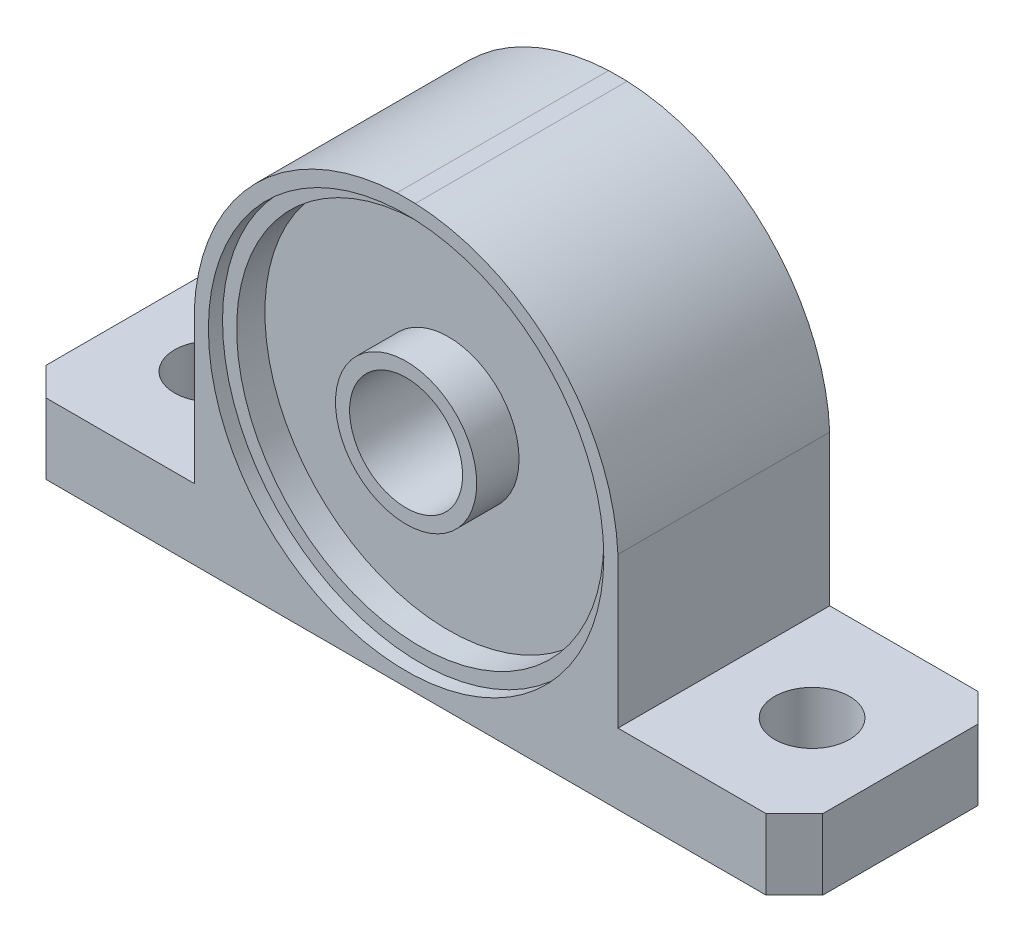
ISO-10303-21;
HEADER;
FILE_DESCRIPTION(('STEP AP214'),'2;1');
FILE_NAME('part.step','',(''),(''),'','','');
FILE_SCHEMA(('AUTOMOTIVE_DESIGN { 1 0 10303 214 1 1 1 1 }'));
ENDSEC;
DATA;
#1=APPLICATION_CONTEXT('core data for automotive mechanical design processes');
#2=APPLICATION_PROTOCOL_DEFINITION('international standard','automotive_design',2000,#1);
#3=PRODUCT_CONTEXT('',#1,'mechanical');
#4=PRODUCT('Part','Part','',(#3));
#5=PRODUCT_RELATED_PRODUCT_CATEGORY('part','',(#4));
#6=PRODUCT_DEFINITION_FORMATION('','',#4);
#7=PRODUCT_DEFINITION_CONTEXT('part definition',#1,'design');
#8=PRODUCT_DEFINITION('design','',#6,#7);
#9=PRODUCT_DEFINITION_SHAPE('','',#8);
#10=(LENGTH_UNIT() NAMED_UNIT(*) SI_UNIT(.MILLI.,.METRE.));
#11=(NAMED_UNIT(*) PLANE_ANGLE_UNIT() SI_UNIT($,.RADIAN.));
#12=(NAMED_UNIT(*) SI_UNIT($,.STERADIAN.) SOLID_ANGLE_UNIT());
#13=UNCERTAINTY_MEASURE_WITH_UNIT(LENGTH_MEASURE(1.E-05),#10,'distance_accuracy_value','');
#14=(GEOMETRIC_REPRESENTATION_CONTEXT(3) GLOBAL_UNCERTAINTY_ASSIGNED_CONTEXT((#13)) GLOBAL_UNIT_ASSIGNED_CONTEXT((#10,
#11,#12)) REPRESENTATION_CONTEXT('',''));
#15=CARTESIAN_POINT('',(0.,0.,0.));
#16=DIRECTION('',(0.,0.,1.));
#17=DIRECTION('',(1.,0.,0.));
#18=AXIS2_PLACEMENT_3D('',#15,#16,#17);
#19=CARTESIAN_POINT('',(0.,0.,0.));
#20=DIRECTION('',(0.,-1.,0.));
#21=DIRECTION('',(0.,0.,-1.));
#22=AXIS2_PLACEMENT_3D('',#19,#20,#21);
#23=PLANE('',#22);
#24=CARTESIAN_POINT('',(21.25,0.,0.));
#25=DIRECTION('',(0.,1.,0.));
#26=DIRECTION('',(0.,0.,1.));
#27=AXIS2_PLACEMENT_3D('',#24,#25,#26);
#28=CIRCLE('',#27,2.65);
#29=CARTESIAN_POINT('',(21.25,0.,2.65000000000001));
#30=VERTEX_POINT('',#29);
#31=EDGE_CURVE('E317',#30,#30,#28,.F.);
#32=ORIENTED_EDGE('',*,*,#31,.F.);
#33=EDGE_LOOP('',(#32));
#34=FACE_BOUND('',#33,.T.);
#35=DIRECTION('',(-1.,0.,0.));
#36=VECTOR('',#35,1.);
#37=CARTESIAN_POINT('',(-25.5,0.,-7.5));
#38=LINE('',#37,#36);
#39=CARTESIAN_POINT('',(25.5,0.,-7.5));
#40=VERTEX_POINT('',#39);
#41=CARTESIAN_POINT('',(-25.5,0.,-7.5));
#42=VERTEX_POINT('',#41);
#43=EDGE_CURVE('E164',#40,#42,#38,.T.);
#44=ORIENTED_EDGE('',*,*,#43,.F.);
#45=DIRECTION('',(-0.707106781186548,0.,-0.707106781186547));
#46=VECTOR('',#45,1.);
#47=CARTESIAN_POINT('',(25.5,0.,-7.5));
#48=LINE('',#47,#46);
#49=CARTESIAN_POINT('',(27.5,0.,-5.5));
#50=VERTEX_POINT('',#49);
#51=EDGE_CURVE('E204',#50,#40,#48,.T.);
#52=ORIENTED_EDGE('',*,*,#51,.F.);
#53=DIRECTION('',(0.,0.,-1.));
#54=VECTOR('',#53,1.);
#55=CARTESIAN_POINT('',(27.5,0.,-5.5));
#56=LINE('',#55,#54);
#57=CARTESIAN_POINT('',(27.5,0.,5.5));
#58=VERTEX_POINT('',#57);
#59=EDGE_CURVE('E202',#58,#50,#56,.T.);
#60=ORIENTED_EDGE('',*,*,#59,.F.);
#61=DIRECTION('',(0.707106781186548,0.,-0.707106781186547));
#62=VECTOR('',#61,1.);
#63=CARTESIAN_POINT('',(25.5,0.,7.5));
#64=LINE('',#63,#62);
#65=CARTESIAN_POINT('',(25.5,0.,7.5));
#66=VERTEX_POINT('',#65);
#67=EDGE_CURVE('E200',#66,#58,#64,.T.);
#68=ORIENTED_EDGE('',*,*,#67,.F.);
#69=DIRECTION('',(1.,0.,0.));
#70=VECTOR('',#69,1.);
#71=CARTESIAN_POINT('',(-25.5,0.,7.5));
#72=LINE('',#71,#70);
#73=CARTESIAN_POINT('',(-25.5,0.,7.5));
#74=VERTEX_POINT('',#73);
#75=EDGE_CURVE('E198',#74,#66,#72,.T.);
#76=ORIENTED_EDGE('',*,*,#75,.F.);
#77=DIRECTION('',(0.707106781186548,0.,0.707106781186547));
#78=VECTOR('',#77,1.);
#79=CARTESIAN_POINT('',(-27.5,0.,5.5));
#80=LINE('',#79,#78);
#81=CARTESIAN_POINT('',(-27.5,0.,5.5));
#82=VERTEX_POINT('',#81);
#83=EDGE_CURVE('E196',#82,#74,#80,.T.);
#84=ORIENTED_EDGE('',*,*,#83,.F.);
#85=DIRECTION('',(0.,0.,1.));
#86=VECTOR('',#85,1.);
#87=CARTESIAN_POINT('',(-27.5,0.,-5.5));
#88=LINE('',#87,#86);
#89=CARTESIAN_POINT('',(-27.5,0.,-5.5));
#90=VERTEX_POINT('',#89);
#91=EDGE_CURVE('E194',#90,#82,#88,.T.);
#92=ORIENTED_EDGE('',*,*,#91,.F.);
#93=DIRECTION('',(-0.707106781186548,0.,0.707106781186547));
#94=VECTOR('',#93,1.);
#95=CARTESIAN_POINT('',(-27.5,0.,-5.5));
#96=LINE('',#95,#94);
#97=EDGE_CURVE('E192',#42,#90,#96,.T.);
#98=ORIENTED_EDGE('',*,*,#97,.F.);
#99=EDGE_LOOP('',(#44,#52,#60,#68,#76,#84,#92,#98));
#100=FACE_BOUND('',#99,.T.);
#101=CARTESIAN_POINT('',(-21.25,0.,0.));
#102=DIRECTION('',(0.,1.,0.));
#103=DIRECTION('',(0.,0.,1.));
#104=AXIS2_PLACEMENT_3D('',#101,#102,#103);
#105=CIRCLE('',#104,2.65);
#106=CARTESIAN_POINT('',(-21.25,0.,2.65));
#107=VERTEX_POINT('',#106);
#108=EDGE_CURVE('E313',#107,#107,#105,.T.);
#109=ORIENTED_EDGE('',*,*,#108,.T.);
#110=EDGE_LOOP('',(#109));
#111=FACE_BOUND('',#110,.T.);
#112=ADVANCED_FACE('F40',(#34,#100,#111),#23,.T.);
#113=CARTESIAN_POINT('',(0.,15.,-7.5));
#114=DIRECTION('',(0.,0.,1.));
#115=DIRECTION('',(1.,0.,0.));
#116=AXIS2_PLACEMENT_3D('',#113,#114,#115);
#117=CYLINDRICAL_SURFACE('',#116,4.);
#118=CARTESIAN_POINT('',(0.,15.,7.5));
#119=DIRECTION('',(0.,0.,-1.));
#120=DIRECTION('',(-1.,0.,0.));
#121=AXIS2_PLACEMENT_3D('',#118,#119,#120);
#122=CIRCLE('',#121,4.);
#123=CARTESIAN_POINT('',(4.,15.,7.5));
#124=VERTEX_POINT('',#123);
#125=EDGE_CURVE('E44',#124,#124,#122,.T.);
#126=CARTESIAN_POINT('',(0.,15.,-5.5));
#127=DIRECTION('',(0.,0.,-1.));
#128=DIRECTION('',(-1.,0.,0.));
#129=AXIS2_PLACEMENT_3D('',#126,#127,#128);
#130=CIRCLE('',#129,4.);
#131=CARTESIAN_POINT('',(4.,15.,-5.5));
#132=VERTEX_POINT('',#131);
#133=EDGE_CURVE('E303',#132,#132,#130,.F.);
#134=CARTESIAN_POINT('',(4.,15.,7.5));
#135=CARTESIAN_POINT('',(4.,15.,7.36458333333333));
#136=CARTESIAN_POINT('',(4.,15.,7.22916666666667));
#137=CARTESIAN_POINT('',(4.,15.,6.95833333333333));
#138=CARTESIAN_POINT('',(4.,15.,6.82291666666667));
#139=CARTESIAN_POINT('',(4.,15.,6.55208333333333));
#140=CARTESIAN_POINT('',(4.,15.,6.41666666666667));
#141=CARTESIAN_POINT('',(4.,15.,6.14583333333333));
#142=CARTESIAN_POINT('',(4.,15.,6.01041666666667));
#143=CARTESIAN_POINT('',(4.,15.,5.73958333333333));
#144=CARTESIAN_POINT('',(4.,15.,5.60416666666667));
#145=CARTESIAN_POINT('',(4.,15.,5.33333333333333));
#146=CARTESIAN_POINT('',(4.,15.,5.19791666666667));
#147=CARTESIAN_POINT('',(4.,15.,4.92708333333333));
#148=CARTESIAN_POINT('',(4.,15.,4.79166666666667));
#149=CARTESIAN_POINT('',(4.,15.,4.52083333333333));
#150=CARTESIAN_POINT('',(4.,15.,4.38541666666667));
#151=CARTESIAN_POINT('',(4.,15.,4.11458333333333));
#152=CARTESIAN_POINT('',(4.,15.,3.97916666666667));
#153=CARTESIAN_POINT('',(4.,15.,3.70833333333333));
#154=CARTESIAN_POINT('',(4.,15.,3.57291666666667));
#155=CARTESIAN_POINT('',(4.,15.,3.30208333333333));
#156=CARTESIAN_POINT('',(4.,15.,3.16666666666667));
#157=CARTESIAN_POINT('',(4.,15.,2.89583333333333));
#158=CARTESIAN_POINT('',(4.,15.,2.76041666666667));
#159=CARTESIAN_POINT('',(4.,15.,2.48958333333333));
#160=CARTESIAN_POINT('',(4.,15.,2.35416666666667));
#161=CARTESIAN_POINT('',(4.,15.,2.08333333333333));
#162=CARTESIAN_POINT('',(4.,15.,1.94791666666666));
#163=CARTESIAN_POINT('',(4.,15.,1.67708333333333));
#164=CARTESIAN_POINT('',(4.,15.,1.54166666666667));
#165=CARTESIAN_POINT('',(4.,15.,1.27083333333333));
#166=CARTESIAN_POINT('',(4.,15.,1.13541666666667));
#167=CARTESIAN_POINT('',(4.,15.,0.864583333333332));
#168=CARTESIAN_POINT('',(4.,15.,0.729166666666666));
#169=CARTESIAN_POINT('',(4.,15.,0.458333333333333));
#170=CARTESIAN_POINT('',(4.,15.,0.322916666666666));
#171=CARTESIAN_POINT('',(4.,15.,0.0520833333333334));
#172=CARTESIAN_POINT('',(4.,15.,-0.0833333333333334));
#173=CARTESIAN_POINT('',(4.,15.,-0.354166666666667));
#174=CARTESIAN_POINT('',(4.,15.,-0.489583333333333));
#175=CARTESIAN_POINT('',(4.,15.,-0.760416666666667));
#176=CARTESIAN_POINT('',(4.,15.,-0.895833333333333));
#177=CARTESIAN_POINT('',(4.,15.,-1.16666666666667));
#178=CARTESIAN_POINT('',(4.,15.,-1.30208333333333));
#179=CARTESIAN_POINT('',(4.,15.,-1.57291666666667));
#180=CARTESIAN_POINT('',(4.,15.,-1.70833333333333));
#181=CARTESIAN_POINT('',(4.,15.,-1.97916666666667));
#182=CARTESIAN_POINT('',(4.,15.,-2.11458333333333));
#183=CARTESIAN_POINT('',(4.,15.,-2.38541666666667));
#184=CARTESIAN_POINT('',(4.,15.,-2.52083333333333));
#185=CARTESIAN_POINT('',(4.,15.,-2.79166666666667));
#186=CARTESIAN_POINT('',(4.,15.,-2.92708333333333));
#187=CARTESIAN_POINT('',(4.,15.,-3.19791666666667));
#188=CARTESIAN_POINT('',(4.,15.,-3.33333333333333));
#189=CARTESIAN_POINT('',(4.,15.,-3.60416666666667));
#190=CARTESIAN_POINT('',(4.,15.,-3.73958333333333));
#191=CARTESIAN_POINT('',(4.,15.,-4.01041666666667));
#192=CARTESIAN_POINT('',(4.,15.,-4.14583333333333));
#193=CARTESIAN_POINT('',(4.,15.,-4.41666666666667));
#194=CARTESIAN_POINT('',(4.,15.,-4.55208333333333));
#195=CARTESIAN_POINT('',(4.,15.,-4.82291666666667));
#196=CARTESIAN_POINT('',(4.,15.,-4.95833333333333));
#197=CARTESIAN_POINT('',(4.,15.,-5.22916666666667));
#198=CARTESIAN_POINT('',(4.,15.,-5.36458333333333));
#199=CARTESIAN_POINT('',(4.,15.,-5.5));
#200=B_SPLINE_CURVE_WITH_KNOTS('',3,(#134,#135,#136,#137,#138,#139,#140,#141,#142,#143,#144,
#145,#146,#147,#148,#149,#150,#151,#152,#153,#154,#155,#156,#157,#158,#159,#160,#161,#162,#163,
#164,#165,#166,#167,#168,#169,#170,#171,#172,#173,#174,#175,#176,#177,#178,#179,#180,#181,#182,
#183,#184,#185,#186,#187,#188,#189,#190,#191,#192,#193,#194,#195,#196,#197,#198,#199),
.UNSPECIFIED.,.F.,.F.,(4,2,2,2,2,2,2,2,2,2,2,2,2,2,2,2,2,2,2,2,2,2,2,2,2,2,2,2,2,2,2,2,4),(0.,
0.40625,0.812500000000001,1.21875,1.625,2.03125,2.4375,2.84375,3.25,3.65625,4.0625,4.46875,
4.875,5.28125,5.6875,6.09375,6.5,6.90625,7.3125,7.71875,8.125,8.53125,8.9375,9.34375,9.75,
10.15625,10.5625,10.96875,11.375,11.78125,12.1875,12.59375,13.),.UNSPECIFIED.);
#201=EDGE_CURVE('BSEAM345',#124,#132,#200,.T.);
#202=ORIENTED_EDGE('',*,*,#125,.F.);
#203=ORIENTED_EDGE('',*,*,#133,.F.);
#204=ORIENTED_EDGE('',*,*,#201,.T.);
#205=ORIENTED_EDGE('',*,*,#201,.F.);
#206=EDGE_LOOP('',(#202,#204,#203,#205));
#207=FACE_BOUND('',#206,.T.);
#208=ADVANCED_FACE('F345',(#207),#117,.F.);
#209=CARTESIAN_POINT('',(0.,15.,-4.5));
#210=DIRECTION('',(0.,0.,-1.));
#211=DIRECTION('',(-1.,0.,0.));
#212=AXIS2_PLACEMENT_3D('',#209,#210,#211);
#213=CYLINDRICAL_SURFACE('',#212,5.);
#214=CARTESIAN_POINT('',(0.,15.,-4.5));
#215=DIRECTION('',(0.,0.,-1.));
#216=DIRECTION('',(-1.,0.,0.));
#217=AXIS2_PLACEMENT_3D('',#214,#215,#216);
#218=CIRCLE('',#217,5.);
#219=CARTESIAN_POINT('',(-5.,15.,-4.5));
#220=VERTEX_POINT('',#219);
#221=EDGE_CURVE('E288',#220,#220,#218,.F.);
#222=ORIENTED_EDGE('',*,*,#221,.F.);
#223=EDGE_LOOP('',(#222));
#224=FACE_BOUND('',#223,.T.);
#225=CARTESIAN_POINT('',(0.,15.,-5.5));
#226=DIRECTION('',(0.,0.,-1.));
#227=DIRECTION('',(-1.,0.,0.));
#228=AXIS2_PLACEMENT_3D('',#225,#226,#227);
#229=CIRCLE('',#228,5.);
#230=CARTESIAN_POINT('',(-5.,15.,-5.5));
#231=VERTEX_POINT('',#230);
#232=EDGE_CURVE('E310',#231,#231,#229,.F.);
#233=ORIENTED_EDGE('',*,*,#232,.T.);
#234=EDGE_LOOP('',(#233));
#235=FACE_BOUND('',#234,.T.);
#236=ADVANCED_FACE('F350',(#224,#235),#213,.T.);
#237=CARTESIAN_POINT('',(-25.5,5.,-7.5));
#238=DIRECTION('',(0.,0.,1.));
#239=DIRECTION('',(1.,0.,0.));
#240=AXIS2_PLACEMENT_3D('',#237,#238,#239);
#241=PLANE('',#240);
#242=DIRECTION('',(0.,-1.,0.));
#243=VECTOR('',#242,1.);
#244=CARTESIAN_POINT('',(-15.,30.,-7.5));
#245=LINE('',#244,#243);
#246=CARTESIAN_POINT('',(-15.,15.6527900412671,-7.5));
#247=VERTEX_POINT('',#246);
#248=CARTESIAN_POINT('',(-15.,5.,-7.5));
#249=VERTEX_POINT('',#248);
#250=EDGE_CURVE('E154',#247,#249,#245,.T.);
#251=ORIENTED_EDGE('',*,*,#250,.F.);
#252=CARTESIAN_POINT('',(0.,15.,-7.5));
#253=DIRECTION('',(0.,0.,1.));
#254=DIRECTION('',(1.,0.,0.));
#255=AXIS2_PLACEMENT_3D('',#252,#253,#254);
#256=CIRCLE('',#255,15.0141977753717);
#257=CARTESIAN_POINT('',(-0.65279004126701,30.,-7.5));
#258=VERTEX_POINT('',#257);
#259=EDGE_CURVE('E140',#247,#258,#256,.F.);
#260=ORIENTED_EDGE('',*,*,#259,.T.);
#261=DIRECTION('',(-1.,0.,0.));
#262=VECTOR('',#261,1.);
#263=CARTESIAN_POINT('',(-15.,30.,-7.5));
#264=LINE('',#263,#262);
#265=CARTESIAN_POINT('',(0.652790041267009,30.,-7.5));
#266=VERTEX_POINT('',#265);
#267=EDGE_CURVE('E250',#266,#258,#264,.T.);
#268=ORIENTED_EDGE('',*,*,#267,.F.);
#269=CARTESIAN_POINT('',(0.,15.,-7.5));
#270=DIRECTION('',(0.,0.,1.));
#271=DIRECTION('',(1.,0.,0.));
#272=AXIS2_PLACEMENT_3D('',#269,#270,#271);
#273=CIRCLE('',#272,15.0141977753717);
#274=CARTESIAN_POINT('',(15.,15.6527900412671,-7.5));
#275=VERTEX_POINT('',#274);
#276=EDGE_CURVE('E64',#266,#275,#273,.F.);
#277=ORIENTED_EDGE('',*,*,#276,.T.);
#278=DIRECTION('',(0.,-1.,0.));
#279=VECTOR('',#278,1.);
#280=CARTESIAN_POINT('',(15.,30.,-7.5));
#281=LINE('',#280,#279);
#282=CARTESIAN_POINT('',(15.,5.,-7.5));
#283=VERTEX_POINT('',#282);
#284=EDGE_CURVE('E162',#275,#283,#281,.T.);
#285=ORIENTED_EDGE('',*,*,#284,.T.);
#286=DIRECTION('',(-1.,0.,0.));
#287=VECTOR('',#286,1.);
#288=CARTESIAN_POINT('',(-25.5,5.,-7.5));
#289=LINE('',#288,#287);
#290=CARTESIAN_POINT('',(25.5,5.,-7.5));
#291=VERTEX_POINT('',#290);
#292=EDGE_CURVE('E170',#291,#283,#289,.T.);
#293=ORIENTED_EDGE('',*,*,#292,.F.);
#294=DIRECTION('',(0.,-1.,0.));
#295=VECTOR('',#294,1.);
#296=CARTESIAN_POINT('',(25.5,5.,-7.5));
#297=LINE('',#296,#295);
#298=EDGE_CURVE('E189',#291,#40,#297,.T.);
#299=ORIENTED_EDGE('',*,*,#298,.T.);
#300=ORIENTED_EDGE('',*,*,#43,.T.);
#301=DIRECTION('',(0.,-1.,0.));
#302=VECTOR('',#301,1.);
#303=CARTESIAN_POINT('',(-25.5,5.,-7.5));
#304=LINE('',#303,#302);
#305=CARTESIAN_POINT('',(-25.5,5.,-7.5));
#306=VERTEX_POINT('',#305);
#307=EDGE_CURVE('E11',#306,#42,#304,.T.);
#308=ORIENTED_EDGE('',*,*,#307,.F.);
#309=EDGE_CURVE('E161',#249,#306,#289,.T.);
#310=ORIENTED_EDGE('',*,*,#309,.F.);
#311=EDGE_LOOP('',(#251,#260,#268,#277,#285,#293,#299,#300,#308,#310));
#312=FACE_BOUND('',#311,.T.);
#313=CARTESIAN_POINT('',(0.,15.,-7.5));
#314=DIRECTION('',(0.,0.,-1.));
#315=DIRECTION('',(-1.,0.,0.));
#316=AXIS2_PLACEMENT_3D('',#313,#314,#315);
#317=CIRCLE('',#316,14.);
#318=CARTESIAN_POINT('',(-14.,15.,-7.5));
#319=VERTEX_POINT('',#318);
#320=EDGE_CURVE('E299',#319,#319,#317,.F.);
#321=ORIENTED_EDGE('',*,*,#320,.T.);
#322=EDGE_LOOP('',(#321));
#323=FACE_BOUND('',#322,.T.);
#324=ADVANCED_FACE('F42',(#312,#323),#241,.F.);
#325=CARTESIAN_POINT('',(0.,15.,-4.5));
#326=DIRECTION('',(0.,0.,-1.));
#327=DIRECTION('',(-1.,0.,0.));
#328=AXIS2_PLACEMENT_3D('',#325,#326,#327);
#329=CYLINDRICAL_SURFACE('',#328,13.);
#330=CARTESIAN_POINT('',(0.,15.,-4.5));
#331=DIRECTION('',(0.,0.,-1.));
#332=DIRECTION('',(-1.,0.,0.));
#333=AXIS2_PLACEMENT_3D('',#330,#331,#332);
#334=CIRCLE('',#333,13.);
#335=CARTESIAN_POINT('',(-13.,15.,-4.5));
#336=VERTEX_POINT('',#335);
#337=EDGE_CURVE('E295',#336,#336,#334,.F.);
#338=ORIENTED_EDGE('',*,*,#337,.T.);
#339=EDGE_LOOP('',(#338));
#340=FACE_BOUND('',#339,.T.);
#341=CARTESIAN_POINT('',(0.,15.,-6.5));
#342=DIRECTION('',(0.,0.,-1.));
#343=DIRECTION('',(-1.,0.,0.));
#344=AXIS2_PLACEMENT_3D('',#341,#342,#343);
#345=CIRCLE('',#344,13.);
#346=CARTESIAN_POINT('',(-13.,15.,-6.5));
#347=VERTEX_POINT('',#346);
#348=EDGE_CURVE('E298',#347,#347,#345,.F.);
#349=ORIENTED_EDGE('',*,*,#348,.F.);
#350=EDGE_LOOP('',(#349));
#351=FACE_BOUND('',#350,.T.);
#352=ADVANCED_FACE('F548',(#340,#351),#329,.F.);
#353=CARTESIAN_POINT('',(-25.5,5.,7.5));
#354=DIRECTION('',(0.,0.,-1.));
#355=DIRECTION('',(-1.,0.,0.));
#356=AXIS2_PLACEMENT_3D('',#353,#354,#355);
#357=PLANE('',#356);
#358=ORIENTED_EDGE('',*,*,#125,.T.);
#359=EDGE_LOOP('',(#358));
#360=FACE_BOUND('',#359,.T.);
#361=CARTESIAN_POINT('',(0.,15.,7.5));
#362=DIRECTION('',(0.,0.,1.));
#363=DIRECTION('',(1.,0.,0.));
#364=AXIS2_PLACEMENT_3D('',#361,#362,#363);
#365=CIRCLE('',#364,5.);
#366=CARTESIAN_POINT('',(5.,15.,7.5));
#367=VERTEX_POINT('',#366);
#368=EDGE_CURVE('E284',#367,#367,#365,.T.);
#369=ORIENTED_EDGE('',*,*,#368,.T.);
#370=EDGE_LOOP('',(#369));
#371=FACE_BOUND('',#370,.T.);
#372=ADVANCED_FACE('F370',(#360,#371),#357,.F.);
#373=CARTESIAN_POINT('',(0.,15.,7.5));
#374=DIRECTION('',(0.,0.,1.));
#375=DIRECTION('',(1.,0.,0.));
#376=AXIS2_PLACEMENT_3D('',#373,#374,#375);
#377=CIRCLE('',#376,14.);
#378=CARTESIAN_POINT('',(14.,15.,7.5));
#379=VERTEX_POINT('',#378);
#380=EDGE_CURVE('E275',#379,#379,#377,.T.);
#381=ORIENTED_EDGE('',*,*,#380,.F.);
#382=EDGE_LOOP('',(#381));
#383=FACE_BOUND('',#382,.T.);
#384=DIRECTION('',(1.,0.,0.));
#385=VECTOR('',#384,1.);
#386=CARTESIAN_POINT('',(-15.,30.,7.5));
#387=LINE('',#386,#385);
#388=CARTESIAN_POINT('',(-0.652790041267013,30.,7.5));
#389=VERTEX_POINT('',#388);
#390=CARTESIAN_POINT('',(0.65279004126701,30.,7.5));
#391=VERTEX_POINT('',#390);
#392=EDGE_CURVE('E253',#389,#391,#387,.T.);
#393=ORIENTED_EDGE('',*,*,#392,.F.);
#394=CARTESIAN_POINT('',(0.,15.,7.5));
#395=DIRECTION('',(0.,0.,1.));
#396=DIRECTION('',(1.,0.,0.));
#397=AXIS2_PLACEMENT_3D('',#394,#395,#396);
#398=CIRCLE('',#397,15.0141977753717);
#399=CARTESIAN_POINT('',(-15.,15.6527900412671,7.5));
#400=VERTEX_POINT('',#399);
#401=EDGE_CURVE('E56',#400,#389,#398,.F.);
#402=ORIENTED_EDGE('',*,*,#401,.F.);
#403=DIRECTION('',(0.,-1.,0.));
#404=VECTOR('',#403,1.);
#405=CARTESIAN_POINT('',(-15.,30.,7.5));
#406=LINE('',#405,#404);
#407=CARTESIAN_POINT('',(-15.,5.,7.5));
#408=VERTEX_POINT('',#407);
#409=EDGE_CURVE('E156',#400,#408,#406,.T.);
#410=ORIENTED_EDGE('',*,*,#409,.T.);
#411=DIRECTION('',(1.,0.,0.));
#412=VECTOR('',#411,1.);
#413=CARTESIAN_POINT('',(-25.5,5.,7.5));
#414=LINE('',#413,#412);
#415=CARTESIAN_POINT('',(-25.5,5.,7.5));
#416=VERTEX_POINT('',#415);
#417=EDGE_CURVE('E180',#416,#408,#414,.T.);
#418=ORIENTED_EDGE('',*,*,#417,.F.);
#419=DIRECTION('',(0.,-1.,0.));
#420=VECTOR('',#419,1.);
#421=CARTESIAN_POINT('',(-25.5,5.,7.5));
#422=LINE('',#421,#420);
#423=EDGE_CURVE('E217',#416,#74,#422,.T.);
#424=ORIENTED_EDGE('',*,*,#423,.T.);
#425=ORIENTED_EDGE('',*,*,#75,.T.);
#426=DIRECTION('',(0.,-1.,0.));
#427=VECTOR('',#426,1.);
#428=CARTESIAN_POINT('',(25.5,5.,7.5));
#429=LINE('',#428,#427);
#430=CARTESIAN_POINT('',(25.5,5.,7.5));
#431=VERTEX_POINT('',#430);
#432=EDGE_CURVE('E214',#431,#66,#429,.T.);
#433=ORIENTED_EDGE('',*,*,#432,.F.);
#434=CARTESIAN_POINT('',(15.,5.,7.5));
#435=VERTEX_POINT('',#434);
#436=EDGE_CURVE('E179',#435,#431,#414,.T.);
#437=ORIENTED_EDGE('',*,*,#436,.F.);
#438=DIRECTION('',(0.,-1.,0.));
#439=VECTOR('',#438,1.);
#440=CARTESIAN_POINT('',(15.,30.,7.5));
#441=LINE('',#440,#439);
#442=CARTESIAN_POINT('',(15.,15.6527900412671,7.5));
#443=VERTEX_POINT('',#442);
#444=EDGE_CURVE('E166',#443,#435,#441,.T.);
#445=ORIENTED_EDGE('',*,*,#444,.F.);
#446=CARTESIAN_POINT('',(0.,15.,7.5));
#447=DIRECTION('',(0.,0.,1.));
#448=DIRECTION('',(1.,0.,0.));
#449=AXIS2_PLACEMENT_3D('',#446,#447,#448);
#450=CIRCLE('',#449,15.0141977753717);
#451=EDGE_CURVE('E269',#391,#443,#450,.F.);
#452=ORIENTED_EDGE('',*,*,#451,.F.);
#453=EDGE_LOOP('',(#393,#402,#410,#418,#424,#425,#433,#437,#445,#452));
#454=FACE_BOUND('',#453,.T.);
#455=ADVANCED_FACE('F245',(#383,#454),#357,.F.);
#456=CARTESIAN_POINT('',(0.,5.,0.));
#457=DIRECTION('',(0.,-1.,0.));
#458=DIRECTION('',(0.,0.,-1.));
#459=AXIS2_PLACEMENT_3D('',#456,#457,#458);
#460=PLANE('',#459);
#461=CARTESIAN_POINT('',(21.25,5.,0.));
#462=DIRECTION('',(0.,1.,0.));
#463=DIRECTION('',(0.,0.,1.));
#464=AXIS2_PLACEMENT_3D('',#461,#462,#463);
#465=CIRCLE('',#464,2.65);
#466=CARTESIAN_POINT('',(21.25,5.,2.65000000000001));
#467=VERTEX_POINT('',#466);
#468=EDGE_CURVE('E314',#467,#467,#465,.F.);
#469=ORIENTED_EDGE('',*,*,#468,.T.);
#470=EDGE_LOOP('',(#469));
#471=FACE_BOUND('',#470,.T.);
#472=DIRECTION('',(0.,0.,-1.));
#473=VECTOR('',#472,1.);
#474=CARTESIAN_POINT('',(15.,5.,-7.5));
#475=LINE('',#474,#473);
#476=EDGE_CURVE('E251',#435,#283,#475,.T.);
#477=ORIENTED_EDGE('',*,*,#476,.F.);
#478=ORIENTED_EDGE('',*,*,#436,.T.);
#479=DIRECTION('',(0.707106781186548,0.,-0.707106781186547));
#480=VECTOR('',#479,1.);
#481=CARTESIAN_POINT('',(25.5,5.,7.5));
#482=LINE('',#481,#480);
#483=CARTESIAN_POINT('',(27.5,5.,5.5));
#484=VERTEX_POINT('',#483);
#485=EDGE_CURVE('E183',#431,#484,#482,.T.);
#486=ORIENTED_EDGE('',*,*,#485,.T.);
#487=DIRECTION('',(0.,0.,-1.));
#488=VECTOR('',#487,1.);
#489=CARTESIAN_POINT('',(27.5,5.,-5.5));
#490=LINE('',#489,#488);
#491=CARTESIAN_POINT('',(27.5,5.,-5.5));
#492=VERTEX_POINT('',#491);
#493=EDGE_CURVE('E185',#484,#492,#490,.T.);
#494=ORIENTED_EDGE('',*,*,#493,.T.);
#495=DIRECTION('',(-0.707106781186548,0.,-0.707106781186547));
#496=VECTOR('',#495,1.);
#497=CARTESIAN_POINT('',(25.5,5.,-7.5));
#498=LINE('',#497,#496);
#499=EDGE_CURVE('E187',#492,#291,#498,.T.);
#500=ORIENTED_EDGE('',*,*,#499,.T.);
#501=ORIENTED_EDGE('',*,*,#292,.T.);
#502=EDGE_LOOP('',(#477,#478,#486,#494,#500,#501));
#503=FACE_BOUND('',#502,.T.);
#504=ADVANCED_FACE('F335',(#471,#503),#460,.F.);
#505=CARTESIAN_POINT('',(-21.25,5.,0.));
#506=DIRECTION('',(0.,1.,0.));
#507=DIRECTION('',(0.,0.,1.));
#508=AXIS2_PLACEMENT_3D('',#505,#506,#507);
#509=CIRCLE('',#508,2.65);
#510=CARTESIAN_POINT('',(-21.25,5.,2.65));
#511=VERTEX_POINT('',#510);
#512=EDGE_CURVE('E320',#511,#511,#509,.T.);
#513=ORIENTED_EDGE('',*,*,#512,.F.);
#514=EDGE_LOOP('',(#513));
#515=FACE_BOUND('',#514,.T.);
#516=DIRECTION('',(0.,0.,1.));
#517=VECTOR('',#516,1.);
#518=CARTESIAN_POINT('',(-15.,5.,-7.5));
#519=LINE('',#518,#517);
#520=EDGE_CURVE('E249',#249,#408,#519,.T.);
#521=ORIENTED_EDGE('',*,*,#520,.F.);
#522=ORIENTED_EDGE('',*,*,#309,.T.);
#523=DIRECTION('',(-0.707106781186548,0.,0.707106781186547));
#524=VECTOR('',#523,1.);
#525=CARTESIAN_POINT('',(-27.5,5.,-5.5));
#526=LINE('',#525,#524);
#527=CARTESIAN_POINT('',(-27.5,5.,-5.5));
#528=VERTEX_POINT('',#527);
#529=EDGE_CURVE('E173',#306,#528,#526,.T.);
#530=ORIENTED_EDGE('',*,*,#529,.T.);
#531=DIRECTION('',(0.,0.,1.));
#532=VECTOR('',#531,1.);
#533=CARTESIAN_POINT('',(-27.5,5.,-5.5));
#534=LINE('',#533,#532);
#535=CARTESIAN_POINT('',(-27.5,5.,5.5));
#536=VERTEX_POINT('',#535);
#537=EDGE_CURVE('E175',#528,#536,#534,.T.);
#538=ORIENTED_EDGE('',*,*,#537,.T.);
#539=DIRECTION('',(0.707106781186548,0.,0.707106781186547));
#540=VECTOR('',#539,1.);
#541=CARTESIAN_POINT('',(-27.5,5.,5.5));
#542=LINE('',#541,#540);
#543=EDGE_CURVE('E177',#536,#416,#542,.T.);
#544=ORIENTED_EDGE('',*,*,#543,.T.);
#545=ORIENTED_EDGE('',*,*,#417,.T.);
#546=EDGE_LOOP('',(#521,#522,#530,#538,#544,#545));
#547=FACE_BOUND('',#546,.T.);
#548=ADVANCED_FACE('F248',(#515,#547),#460,.F.);
#549=CARTESIAN_POINT('',(-27.5,5.,-5.5));
#550=DIRECTION('',(0.707106781186547,0.,0.707106781186548));
#551=DIRECTION('',(0.707106781186548,0.,-0.707106781186547));
#552=AXIS2_PLACEMENT_3D('',#549,#550,#551);
#553=PLANE('',#552);
#554=ORIENTED_EDGE('',*,*,#97,.T.);
#555=DIRECTION('',(0.,-1.,0.));
#556=VECTOR('',#555,1.);
#557=CARTESIAN_POINT('',(-27.5,5.,-5.5));
#558=LINE('',#557,#556);
#559=EDGE_CURVE('E49',#528,#90,#558,.T.);
#560=ORIENTED_EDGE('',*,*,#559,.F.);
#561=ORIENTED_EDGE('',*,*,#529,.F.);
#562=ORIENTED_EDGE('',*,*,#307,.T.);
#563=EDGE_LOOP('',(#554,#560,#561,#562));
#564=FACE_BOUND('',#563,.T.);
#565=ADVANCED_FACE('F334',(#564),#553,.F.);
#566=CARTESIAN_POINT('',(-27.5,5.,-5.5));
#567=DIRECTION('',(1.,0.,0.));
#568=DIRECTION('',(0.,0.,-1.));
#569=AXIS2_PLACEMENT_3D('',#566,#567,#568);
#570=PLANE('',#569);
#571=ORIENTED_EDGE('',*,*,#91,.T.);
#572=DIRECTION('',(0.,-1.,0.));
#573=VECTOR('',#572,1.);
#574=CARTESIAN_POINT('',(-27.5,5.,5.5));
#575=LINE('',#574,#573);
#576=EDGE_CURVE('E220',#536,#82,#575,.T.);
#577=ORIENTED_EDGE('',*,*,#576,.F.);
#578=ORIENTED_EDGE('',*,*,#537,.F.);
#579=ORIENTED_EDGE('',*,*,#559,.T.);
#580=EDGE_LOOP('',(#571,#577,#578,#579));
#581=FACE_BOUND('',#580,.T.);
#582=ADVANCED_FACE('F228',(#581),#570,.F.);
#583=CARTESIAN_POINT('',(-27.5,5.,5.5));
#584=DIRECTION('',(0.707106781186547,0.,-0.707106781186548));
#585=DIRECTION('',(-0.707106781186548,0.,-0.707106781186547));
#586=AXIS2_PLACEMENT_3D('',#583,#584,#585);
#587=PLANE('',#586);
#588=ORIENTED_EDGE('',*,*,#83,.T.);
#589=ORIENTED_EDGE('',*,*,#423,.F.);
#590=ORIENTED_EDGE('',*,*,#543,.F.);
#591=ORIENTED_EDGE('',*,*,#576,.T.);
#592=EDGE_LOOP('',(#588,#589,#590,#591));
#593=FACE_BOUND('',#592,.T.);
#594=ADVANCED_FACE('F240',(#593),#587,.F.);
#595=CARTESIAN_POINT('',(25.5,5.,7.5));
#596=DIRECTION('',(-0.707106781186547,0.,-0.707106781186548));
#597=DIRECTION('',(-0.707106781186548,0.,0.707106781186547));
#598=AXIS2_PLACEMENT_3D('',#595,#596,#597);
#599=PLANE('',#598);
#600=ORIENTED_EDGE('',*,*,#67,.T.);
#601=DIRECTION('',(0.,-1.,0.));
#602=VECTOR('',#601,1.);
#603=CARTESIAN_POINT('',(27.5,5.,5.5));
#604=LINE('',#603,#602);
#605=EDGE_CURVE('E211',#484,#58,#604,.T.);
#606=ORIENTED_EDGE('',*,*,#605,.F.);
#607=ORIENTED_EDGE('',*,*,#485,.F.);
#608=ORIENTED_EDGE('',*,*,#432,.T.);
#609=EDGE_LOOP('',(#600,#606,#607,#608));
#610=FACE_BOUND('',#609,.T.);
#611=ADVANCED_FACE('F363',(#610),#599,.F.);
#612=CARTESIAN_POINT('',(27.5,5.,-5.5));
#613=DIRECTION('',(-1.,0.,0.));
#614=DIRECTION('',(0.,0.,1.));
#615=AXIS2_PLACEMENT_3D('',#612,#613,#614);
#616=PLANE('',#615);
#617=ORIENTED_EDGE('',*,*,#59,.T.);
#618=DIRECTION('',(0.,-1.,0.));
#619=VECTOR('',#618,1.);
#620=CARTESIAN_POINT('',(27.5,5.,-5.5));
#621=LINE('',#620,#619);
#622=EDGE_CURVE('E208',#492,#50,#621,.T.);
#623=ORIENTED_EDGE('',*,*,#622,.F.);
#624=ORIENTED_EDGE('',*,*,#493,.F.);
#625=ORIENTED_EDGE('',*,*,#605,.T.);
#626=EDGE_LOOP('',(#617,#623,#624,#625));
#627=FACE_BOUND('',#626,.T.);
#628=ADVANCED_FACE('F359',(#627),#616,.F.);
#629=CARTESIAN_POINT('',(25.5,5.,-7.5));
#630=DIRECTION('',(-0.707106781186547,0.,0.707106781186548));
#631=DIRECTION('',(0.707106781186548,0.,0.707106781186547));
#632=AXIS2_PLACEMENT_3D('',#629,#630,#631);
#633=PLANE('',#632);
#634=ORIENTED_EDGE('',*,*,#51,.T.);
#635=ORIENTED_EDGE('',*,*,#298,.F.);
#636=ORIENTED_EDGE('',*,*,#499,.F.);
#637=ORIENTED_EDGE('',*,*,#622,.T.);
#638=EDGE_LOOP('',(#634,#635,#636,#637));
#639=FACE_BOUND('',#638,.T.);
#640=ADVANCED_FACE('F355',(#639),#633,.F.);
#641=CARTESIAN_POINT('',(15.,30.,-7.5));
#642=DIRECTION('',(-1.,0.,0.));
#643=DIRECTION('',(0.,0.,1.));
#644=AXIS2_PLACEMENT_3D('',#641,#642,#643);
#645=PLANE('',#644);
#646=ORIENTED_EDGE('',*,*,#284,.F.);
#647=DIRECTION('',(0.,0.,1.));
#648=VECTOR('',#647,1.);
#649=CARTESIAN_POINT('',(15.,15.6527900412671,-7.5));
#650=LINE('',#649,#648);
#651=EDGE_CURVE('E267',#275,#443,#650,.T.);
#652=ORIENTED_EDGE('',*,*,#651,.T.);
#653=ORIENTED_EDGE('',*,*,#444,.T.);
#654=ORIENTED_EDGE('',*,*,#476,.T.);
#655=EDGE_LOOP('',(#646,#652,#653,#654));
#656=FACE_BOUND('',#655,.T.);
#657=ADVANCED_FACE('F358',(#656),#645,.F.);
#658=CARTESIAN_POINT('',(-15.,30.,-7.5));
#659=DIRECTION('',(1.,0.,0.));
#660=DIRECTION('',(0.,0.,-1.));
#661=AXIS2_PLACEMENT_3D('',#658,#659,#660);
#662=PLANE('',#661);
#663=ORIENTED_EDGE('',*,*,#409,.F.);
#664=DIRECTION('',(0.,0.,1.));
#665=VECTOR('',#664,1.);
#666=CARTESIAN_POINT('',(-15.,15.6527900412671,-7.5));
#667=LINE('',#666,#665);
#668=EDGE_CURVE('E143',#247,#400,#667,.T.);
#669=ORIENTED_EDGE('',*,*,#668,.F.);
#670=ORIENTED_EDGE('',*,*,#250,.T.);
#671=ORIENTED_EDGE('',*,*,#520,.T.);
#672=EDGE_LOOP('',(#663,#669,#670,#671));
#673=FACE_BOUND('',#672,.T.);
#674=ADVANCED_FACE('F152',(#673),#662,.F.);
#675=CARTESIAN_POINT('',(0.,30.,0.));
#676=DIRECTION('',(0.,1.,0.));
#677=DIRECTION('',(0.,0.,1.));
#678=AXIS2_PLACEMENT_3D('',#675,#676,#677);
#679=PLANE('',#678);
#680=DIRECTION('',(0.,0.,1.));
#681=VECTOR('',#680,1.);
#682=CARTESIAN_POINT('',(-0.65279004126701,30.,-7.5));
#683=LINE('',#682,#681);
#684=EDGE_CURVE('E144',#258,#389,#683,.T.);
#685=ORIENTED_EDGE('',*,*,#684,.T.);
#686=ORIENTED_EDGE('',*,*,#392,.T.);
#687=DIRECTION('',(0.,0.,1.));
#688=VECTOR('',#687,1.);
#689=CARTESIAN_POINT('',(0.65279004126701,30.,-7.5));
#690=LINE('',#689,#688);
#691=EDGE_CURVE('E265',#266,#391,#690,.T.);
#692=ORIENTED_EDGE('',*,*,#691,.F.);
#693=ORIENTED_EDGE('',*,*,#267,.T.);
#694=EDGE_LOOP('',(#685,#686,#692,#693));
#695=FACE_BOUND('',#694,.T.);
#696=ADVANCED_FACE('F406',(#695),#679,.T.);
#697=CARTESIAN_POINT('',(0.,15.,-7.5));
#698=DIRECTION('',(0.,0.,1.));
#699=DIRECTION('',(1.,0.,0.));
#700=AXIS2_PLACEMENT_3D('',#697,#698,#699);
#701=CYLINDRICAL_SURFACE('',#700,15.0141977753717);
#702=ORIENTED_EDGE('',*,*,#451,.T.);
#703=ORIENTED_EDGE('',*,*,#651,.F.);
#704=ORIENTED_EDGE('',*,*,#276,.F.);
#705=ORIENTED_EDGE('',*,*,#691,.T.);
#706=EDGE_LOOP('',(#702,#703,#704,#705));
#707=FACE_BOUND('',#706,.T.);
#708=ADVANCED_FACE('F413',(#707),#701,.T.);
#709=CARTESIAN_POINT('',(0.,15.,-7.5));
#710=DIRECTION('',(0.,0.,1.));
#711=DIRECTION('',(1.,0.,0.));
#712=AXIS2_PLACEMENT_3D('',#709,#710,#711);
#713=CYLINDRICAL_SURFACE('',#712,15.0141977753717);
#714=ORIENTED_EDGE('',*,*,#401,.T.);
#715=ORIENTED_EDGE('',*,*,#684,.F.);
#716=ORIENTED_EDGE('',*,*,#259,.F.);
#717=ORIENTED_EDGE('',*,*,#668,.T.);
#718=EDGE_LOOP('',(#714,#715,#716,#717));
#719=FACE_BOUND('',#718,.T.);
#720=ADVANCED_FACE('F142',(#719),#713,.T.);
#721=CARTESIAN_POINT('',(0.,15.,6.5));
#722=DIRECTION('',(0.,0.,1.));
#723=DIRECTION('',(1.,0.,0.));
#724=AXIS2_PLACEMENT_3D('',#721,#722,#723);
#725=CYLINDRICAL_SURFACE('',#724,14.);
#726=CARTESIAN_POINT('',(0.,15.,6.5));
#727=DIRECTION('',(0.,0.,1.));
#728=DIRECTION('',(1.,0.,0.));
#729=AXIS2_PLACEMENT_3D('',#726,#727,#728);
#730=CIRCLE('',#729,14.);
#731=CARTESIAN_POINT('',(14.,15.,6.5));
#732=VERTEX_POINT('',#731);
#733=EDGE_CURVE('E271',#732,#732,#730,.T.);
#734=ORIENTED_EDGE('',*,*,#733,.F.);
#735=EDGE_LOOP('',(#734));
#736=FACE_BOUND('',#735,.T.);
#737=ORIENTED_EDGE('',*,*,#380,.T.);
#738=EDGE_LOOP('',(#737));
#739=FACE_BOUND('',#738,.T.);
#740=ADVANCED_FACE('F426',(#736,#739),#725,.F.);
#741=CARTESIAN_POINT('',(0.,0.,6.5));
#742=DIRECTION('',(0.,0.,1.));
#743=DIRECTION('',(1.,0.,0.));
#744=AXIS2_PLACEMENT_3D('',#741,#742,#743);
#745=PLANE('',#744);
#746=CARTESIAN_POINT('',(0.,15.,6.5));
#747=DIRECTION('',(0.,0.,1.));
#748=DIRECTION('',(1.,0.,0.));
#749=AXIS2_PLACEMENT_3D('',#746,#747,#748);
#750=CIRCLE('',#749,13.);
#751=CARTESIAN_POINT('',(13.,15.,6.5));
#752=VERTEX_POINT('',#751);
#753=EDGE_CURVE('E280',#752,#752,#750,.T.);
#754=ORIENTED_EDGE('',*,*,#753,.F.);
#755=EDGE_LOOP('',(#754));
#756=FACE_BOUND('',#755,.T.);
#757=ORIENTED_EDGE('',*,*,#733,.T.);
#758=EDGE_LOOP('',(#757));
#759=FACE_BOUND('',#758,.T.);
#760=ADVANCED_FACE('F434',(#756,#759),#745,.T.);
#761=CARTESIAN_POINT('',(0.,15.,4.5));
#762=DIRECTION('',(0.,0.,1.));
#763=DIRECTION('',(1.,0.,0.));
#764=AXIS2_PLACEMENT_3D('',#761,#762,#763);
#765=CYLINDRICAL_SURFACE('',#764,5.);
#766=CARTESIAN_POINT('',(0.,15.,4.5));
#767=DIRECTION('',(0.,0.,1.));
#768=DIRECTION('',(1.,0.,0.));
#769=AXIS2_PLACEMENT_3D('',#766,#767,#768);
#770=CIRCLE('',#769,5.);
#771=CARTESIAN_POINT('',(5.,15.,4.5));
#772=VERTEX_POINT('',#771);
#773=EDGE_CURVE('E287',#772,#772,#770,.T.);
#774=ORIENTED_EDGE('',*,*,#773,.T.);
#775=EDGE_LOOP('',(#774));
#776=FACE_BOUND('',#775,.T.);
#777=ORIENTED_EDGE('',*,*,#368,.F.);
#778=EDGE_LOOP('',(#777));
#779=FACE_BOUND('',#778,.T.);
#780=ADVANCED_FACE('F442',(#776,#779),#765,.T.);
#781=CARTESIAN_POINT('',(0.,15.,4.5));
#782=DIRECTION('',(0.,0.,1.));
#783=DIRECTION('',(1.,0.,0.));
#784=AXIS2_PLACEMENT_3D('',#781,#782,#783);
#785=CYLINDRICAL_SURFACE('',#784,13.);
#786=ORIENTED_EDGE('',*,*,#753,.T.);
#787=EDGE_LOOP('',(#786));
#788=FACE_BOUND('',#787,.T.);
#789=CARTESIAN_POINT('',(0.,15.,4.5));
#790=DIRECTION('',(0.,0.,1.));
#791=DIRECTION('',(1.,0.,0.));
#792=AXIS2_PLACEMENT_3D('',#789,#790,#791);
#793=CIRCLE('',#792,13.);
#794=CARTESIAN_POINT('',(13.,15.,4.5));
#795=VERTEX_POINT('',#794);
#796=EDGE_CURVE('E283',#795,#795,#793,.T.);
#797=ORIENTED_EDGE('',*,*,#796,.F.);
#798=EDGE_LOOP('',(#797));
#799=FACE_BOUND('',#798,.T.);
#800=ADVANCED_FACE('F451',(#788,#799),#785,.F.);
#801=CARTESIAN_POINT('',(0.,0.,4.5));
#802=DIRECTION('',(0.,0.,1.));
#803=DIRECTION('',(1.,0.,0.));
#804=AXIS2_PLACEMENT_3D('',#801,#802,#803);
#805=PLANE('',#804);
#806=ORIENTED_EDGE('',*,*,#773,.F.);
#807=EDGE_LOOP('',(#806));
#808=FACE_BOUND('',#807,.T.);
#809=ORIENTED_EDGE('',*,*,#796,.T.);
#810=EDGE_LOOP('',(#809));
#811=FACE_BOUND('',#810,.T.);
#812=ADVANCED_FACE('F459',(#808,#811),#805,.T.);
#813=CARTESIAN_POINT('',(0.,0.,-4.5));
#814=DIRECTION('',(0.,0.,-1.));
#815=DIRECTION('',(-1.,0.,0.));
#816=AXIS2_PLACEMENT_3D('',#813,#814,#815);
#817=PLANE('',#816);
#818=ORIENTED_EDGE('',*,*,#337,.F.);
#819=EDGE_LOOP('',(#818));
#820=FACE_BOUND('',#819,.T.);
#821=ORIENTED_EDGE('',*,*,#221,.T.);
#822=EDGE_LOOP('',(#821));
#823=FACE_BOUND('',#822,.T.);
#824=ADVANCED_FACE('F467',(#820,#823),#817,.T.);
#825=CARTESIAN_POINT('',(0.,15.,-6.5));
#826=DIRECTION('',(0.,0.,-1.));
#827=DIRECTION('',(-1.,0.,0.));
#828=AXIS2_PLACEMENT_3D('',#825,#826,#827);
#829=CYLINDRICAL_SURFACE('',#828,14.);
#830=CARTESIAN_POINT('',(0.,15.,-6.5));
#831=DIRECTION('',(0.,0.,-1.));
#832=DIRECTION('',(-1.,0.,0.));
#833=AXIS2_PLACEMENT_3D('',#830,#831,#832);
#834=CIRCLE('',#833,14.);
#835=CARTESIAN_POINT('',(-14.,15.,-6.5));
#836=VERTEX_POINT('',#835);
#837=EDGE_CURVE('E302',#836,#836,#834,.F.);
#838=ORIENTED_EDGE('',*,*,#837,.T.);
#839=EDGE_LOOP('',(#838));
#840=FACE_BOUND('',#839,.T.);
#841=ORIENTED_EDGE('',*,*,#320,.F.);
#842=EDGE_LOOP('',(#841));
#843=FACE_BOUND('',#842,.T.);
#844=ADVANCED_FACE('F475',(#840,#843),#829,.F.);
#845=CARTESIAN_POINT('',(0.,0.,-6.5));
#846=DIRECTION('',(0.,0.,-1.));
#847=DIRECTION('',(-1.,0.,0.));
#848=AXIS2_PLACEMENT_3D('',#845,#846,#847);
#849=PLANE('',#848);
#850=ORIENTED_EDGE('',*,*,#837,.F.);
#851=EDGE_LOOP('',(#850));
#852=FACE_BOUND('',#851,.T.);
#853=ORIENTED_EDGE('',*,*,#348,.T.);
#854=EDGE_LOOP('',(#853));
#855=FACE_BOUND('',#854,.T.);
#856=ADVANCED_FACE('F484',(#852,#855),#849,.T.);
#857=CARTESIAN_POINT('',(0.,0.,-5.5));
#858=DIRECTION('',(0.,0.,-1.));
#859=DIRECTION('',(-1.,0.,0.));
#860=AXIS2_PLACEMENT_3D('',#857,#858,#859);
#861=PLANE('',#860);
#862=ORIENTED_EDGE('',*,*,#232,.F.);
#863=EDGE_LOOP('',(#862));
#864=FACE_BOUND('',#863,.T.);
#865=ORIENTED_EDGE('',*,*,#133,.T.);
#866=EDGE_LOOP('',(#865));
#867=FACE_BOUND('',#866,.T.);
#868=ADVANCED_FACE('F493',(#864,#867),#861,.T.);
#869=CARTESIAN_POINT('',(21.25,0.,0.));
#870=DIRECTION('',(0.,1.,0.));
#871=DIRECTION('',(0.,0.,1.));
#872=AXIS2_PLACEMENT_3D('',#869,#870,#871);
#873=CYLINDRICAL_SURFACE('',#872,2.65);
#874=ORIENTED_EDGE('',*,*,#31,.T.);
#875=EDGE_LOOP('',(#874));
#876=FACE_BOUND('',#875,.T.);
#877=ORIENTED_EDGE('',*,*,#468,.F.);
#878=EDGE_LOOP('',(#877));
#879=FACE_BOUND('',#878,.T.);
#880=ADVANCED_FACE('F329',(#876,#879),#873,.F.);
#881=CARTESIAN_POINT('',(-21.25,0.,0.));
#882=DIRECTION('',(0.,1.,0.));
#883=DIRECTION('',(0.,0.,1.));
#884=AXIS2_PLACEMENT_3D('',#881,#882,#883);
#885=CYLINDRICAL_SURFACE('',#884,2.65);
#886=ORIENTED_EDGE('',*,*,#108,.F.);
#887=EDGE_LOOP('',(#886));
#888=FACE_BOUND('',#887,.T.);
#889=ORIENTED_EDGE('',*,*,#512,.T.);
#890=EDGE_LOOP('',(#889));
#891=FACE_BOUND('',#890,.T.);
#892=ADVANCED_FACE('F326',(#888,#891),#885,.F.);
#893=CLOSED_SHELL('',(#112,#208,#236,#324,#352,#372,#455,#504,#548,#565,#582,#594,#611,#628,
#640,#657,#674,#696,#708,#720,#740,#760,#780,#800,#812,#824,#844,#856,#868,#880,#892));
#894=MANIFOLD_SOLID_BREP('B2',#893);
#895=ADVANCED_BREP_SHAPE_REPRESENTATION('',(#18,#894),#14);
#896=SHAPE_DEFINITION_REPRESENTATION(#9,#895);
ENDSEC;
END-ISO-10303-21;
